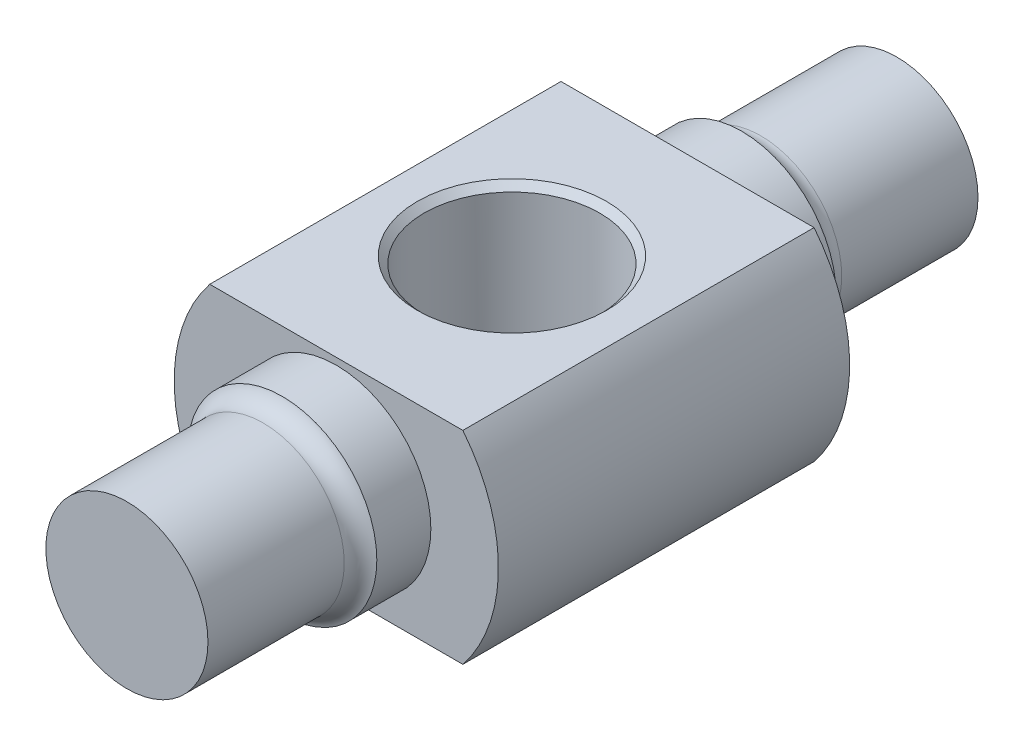
ISO-10303-21;
HEADER;
FILE_DESCRIPTION(('STEP AP214'),'2;1');
FILE_NAME('part.step','',(''),(''),'','','');
FILE_SCHEMA(('AUTOMOTIVE_DESIGN { 1 0 10303 214 1 1 1 1 }'));
ENDSEC;
DATA;
#1=APPLICATION_CONTEXT('core data for automotive mechanical design processes');
#2=APPLICATION_PROTOCOL_DEFINITION('international standard','automotive_design',2000,#1);
#3=PRODUCT_CONTEXT('',#1,'mechanical');
#4=PRODUCT('Part','Part','',(#3));
#5=PRODUCT_RELATED_PRODUCT_CATEGORY('part','',(#4));
#6=PRODUCT_DEFINITION_FORMATION('','',#4);
#7=PRODUCT_DEFINITION_CONTEXT('part definition',#1,'design');
#8=PRODUCT_DEFINITION('design','',#6,#7);
#9=PRODUCT_DEFINITION_SHAPE('','',#8);
#10=(LENGTH_UNIT() NAMED_UNIT(*) SI_UNIT(.MILLI.,.METRE.));
#11=(NAMED_UNIT(*) PLANE_ANGLE_UNIT() SI_UNIT($,.RADIAN.));
#12=(NAMED_UNIT(*) SI_UNIT($,.STERADIAN.) SOLID_ANGLE_UNIT());
#13=UNCERTAINTY_MEASURE_WITH_UNIT(LENGTH_MEASURE(1.E-05),#10,'distance_accuracy_value','');
#14=(GEOMETRIC_REPRESENTATION_CONTEXT(3) GLOBAL_UNCERTAINTY_ASSIGNED_CONTEXT((#13)) GLOBAL_UNIT_ASSIGNED_CONTEXT((#10,
#11,#12)) REPRESENTATION_CONTEXT('',''));
#15=CARTESIAN_POINT('',(0.,0.,0.));
#16=DIRECTION('',(0.,0.,1.));
#17=DIRECTION('',(1.,0.,0.));
#18=AXIS2_PLACEMENT_3D('',#15,#16,#17);
#19=CARTESIAN_POINT('',(0.,0.,11.5));
#20=DIRECTION('',(0.,0.,-1.));
#21=DIRECTION('',(-1.,0.,0.));
#22=AXIS2_PLACEMENT_3D('',#19,#20,#21);
#23=CYLINDRICAL_SURFACE('',#22,6.);
#24=CARTESIAN_POINT('',(0.,0.,10.0857864376269));
#25=DIRECTION('',(0.,0.,1.));
#26=DIRECTION('',(1.,0.,0.));
#27=AXIS2_PLACEMENT_3D('',#24,#25,#26);
#28=CIRCLE('',#27,6.);
#29=CARTESIAN_POINT('',(6.,0.,10.0857864376269));
#30=VERTEX_POINT('',#29);
#31=EDGE_CURVE('E152',#30,#30,#28,.F.);
#32=ORIENTED_EDGE('',*,*,#31,.T.);
#33=EDGE_LOOP('',(#32));
#34=FACE_BOUND('',#33,.T.);
#35=CARTESIAN_POINT('',(0.,0.,0.));
#36=DIRECTION('',(0.,0.,1.));
#37=DIRECTION('',(1.,0.,0.));
#38=AXIS2_PLACEMENT_3D('',#35,#36,#37);
#39=CIRCLE('',#38,6.);
#40=CARTESIAN_POINT('',(6.,0.,0.));
#41=VERTEX_POINT('',#40);
#42=EDGE_CURVE('E140',#41,#41,#39,.T.);
#43=ORIENTED_EDGE('',*,*,#42,.T.);
#44=EDGE_LOOP('',(#43));
#45=FACE_BOUND('',#44,.T.);
#46=ADVANCED_FACE('F44',(#34,#45),#23,.T.);
#47=CARTESIAN_POINT('',(0.,0.,0.));
#48=DIRECTION('',(0.,0.,1.));
#49=DIRECTION('',(1.,0.,0.));
#50=AXIS2_PLACEMENT_3D('',#47,#48,#49);
#51=PLANE('',#50);
#52=ORIENTED_EDGE('',*,*,#42,.F.);
#53=EDGE_LOOP('',(#52));
#54=FACE_BOUND('',#53,.T.);
#55=ADVANCED_FACE('F188',(#54),#51,.F.);
#56=CARTESIAN_POINT('',(0.,0.,15.5));
#57=DIRECTION('',(0.,0.,-1.));
#58=DIRECTION('',(-1.,0.,0.));
#59=AXIS2_PLACEMENT_3D('',#56,#57,#58);
#60=CYLINDRICAL_SURFACE('',#59,7.);
#61=CARTESIAN_POINT('',(0.,0.,15.5));
#62=DIRECTION('',(0.,0.,1.));
#63=DIRECTION('',(1.,0.,0.));
#64=AXIS2_PLACEMENT_3D('',#61,#62,#63);
#65=CIRCLE('',#64,7.);
#66=CARTESIAN_POINT('',(7.,0.,15.5));
#67=VERTEX_POINT('',#66);
#68=EDGE_CURVE('E136',#67,#67,#65,.T.);
#69=ORIENTED_EDGE('',*,*,#68,.F.);
#70=EDGE_LOOP('',(#69));
#71=FACE_BOUND('',#70,.T.);
#72=CARTESIAN_POINT('',(0.,0.,11.5));
#73=DIRECTION('',(0.,0.,1.));
#74=DIRECTION('',(1.,0.,0.));
#75=AXIS2_PLACEMENT_3D('',#72,#73,#74);
#76=CIRCLE('',#75,7.);
#77=CARTESIAN_POINT('',(7.,0.,11.5));
#78=VERTEX_POINT('',#77);
#79=EDGE_CURVE('E135',#78,#78,#76,.T.);
#80=ORIENTED_EDGE('',*,*,#79,.T.);
#81=EDGE_LOOP('',(#80));
#82=FACE_BOUND('',#81,.T.);
#83=ADVANCED_FACE('F184',(#71,#82),#60,.T.);
#84=CARTESIAN_POINT('',(0.,0.,41.5));
#85=DIRECTION('',(0.,0.,-1.));
#86=DIRECTION('',(-1.,0.,0.));
#87=AXIS2_PLACEMENT_3D('',#84,#85,#86);
#88=CYLINDRICAL_SURFACE('',#87,12.);
#89=CARTESIAN_POINT('',(0.,0.,15.5));
#90=DIRECTION('',(0.,0.,1.));
#91=DIRECTION('',(1.,0.,0.));
#92=AXIS2_PLACEMENT_3D('',#89,#90,#91);
#93=CIRCLE('',#92,12.);
#94=CARTESIAN_POINT('',(-9.3674969975976,7.5,15.5));
#95=VERTEX_POINT('',#94);
#96=CARTESIAN_POINT('',(-9.3674969975976,-7.5,15.5));
#97=VERTEX_POINT('',#96);
#98=EDGE_CURVE('E118',#95,#97,#93,.T.);
#99=ORIENTED_EDGE('',*,*,#98,.T.);
#100=DIRECTION('',(0.,0.,-1.));
#101=VECTOR('',#100,1.);
#102=CARTESIAN_POINT('',(-9.3674969975976,-7.5,41.5));
#103=LINE('',#102,#101);
#104=CARTESIAN_POINT('',(-9.3674969975976,-7.5,41.5));
#105=VERTEX_POINT('',#104);
#106=EDGE_CURVE('E107',#105,#97,#103,.T.);
#107=ORIENTED_EDGE('',*,*,#106,.F.);
#108=CARTESIAN_POINT('',(0.,0.,41.5));
#109=DIRECTION('',(0.,0.,1.));
#110=DIRECTION('',(1.,0.,0.));
#111=AXIS2_PLACEMENT_3D('',#108,#109,#110);
#112=CIRCLE('',#111,12.);
#113=CARTESIAN_POINT('',(-9.3674969975976,7.5,41.5));
#114=VERTEX_POINT('',#113);
#115=EDGE_CURVE('E99',#114,#105,#112,.T.);
#116=ORIENTED_EDGE('',*,*,#115,.F.);
#117=DIRECTION('',(0.,0.,-1.));
#118=VECTOR('',#117,1.);
#119=CARTESIAN_POINT('',(-9.3674969975976,7.5,41.5));
#120=LINE('',#119,#118);
#121=EDGE_CURVE('E114',#114,#95,#120,.T.);
#122=ORIENTED_EDGE('',*,*,#121,.T.);
#123=EDGE_LOOP('',(#99,#107,#116,#122));
#124=FACE_BOUND('',#123,.T.);
#125=ADVANCED_FACE('F176',(#124),#88,.T.);
#126=CARTESIAN_POINT('',(-9.3674969975976,-7.5,41.5));
#127=DIRECTION('',(0.,1.,0.));
#128=DIRECTION('',(0.,0.,1.));
#129=AXIS2_PLACEMENT_3D('',#126,#127,#128);
#130=PLANE('',#129);
#131=CARTESIAN_POINT('',(0.,-7.5,28.5));
#132=DIRECTION('',(0.,1.,0.));
#133=DIRECTION('',(0.,0.,1.));
#134=AXIS2_PLACEMENT_3D('',#131,#132,#133);
#135=CIRCLE('',#134,6.99999999999999);
#136=CARTESIAN_POINT('',(0.,-7.5,35.5));
#137=VERTEX_POINT('',#136);
#138=EDGE_CURVE('E156',#137,#137,#135,.T.);
#139=ORIENTED_EDGE('',*,*,#138,.T.);
#140=EDGE_LOOP('',(#139));
#141=FACE_BOUND('',#140,.T.);
#142=DIRECTION('',(1.,0.,0.));
#143=VECTOR('',#142,1.);
#144=CARTESIAN_POINT('',(-9.3674969975976,-7.5,15.5));
#145=LINE('',#144,#143);
#146=CARTESIAN_POINT('',(9.3674969975976,-7.5,15.5));
#147=VERTEX_POINT('',#146);
#148=EDGE_CURVE('E105',#97,#147,#145,.T.);
#149=ORIENTED_EDGE('',*,*,#148,.T.);
#150=DIRECTION('',(0.,0.,-1.));
#151=VECTOR('',#150,1.);
#152=CARTESIAN_POINT('',(9.3674969975976,-7.5,41.5));
#153=LINE('',#152,#151);
#154=CARTESIAN_POINT('',(9.3674969975976,-7.5,41.5));
#155=VERTEX_POINT('',#154);
#156=EDGE_CURVE('E103',#155,#147,#153,.T.);
#157=ORIENTED_EDGE('',*,*,#156,.F.);
#158=DIRECTION('',(1.,0.,0.));
#159=VECTOR('',#158,1.);
#160=CARTESIAN_POINT('',(-9.3674969975976,-7.5,41.5));
#161=LINE('',#160,#159);
#162=EDGE_CURVE('E94',#105,#155,#161,.T.);
#163=ORIENTED_EDGE('',*,*,#162,.F.);
#164=ORIENTED_EDGE('',*,*,#106,.T.);
#165=EDGE_LOOP('',(#149,#157,#163,#164));
#166=FACE_BOUND('',#165,.T.);
#167=ADVANCED_FACE('F104',(#141,#166),#130,.F.);
#168=CARTESIAN_POINT('',(0.,0.,41.5));
#169=DIRECTION('',(0.,0.,-1.));
#170=DIRECTION('',(-1.,0.,0.));
#171=AXIS2_PLACEMENT_3D('',#168,#169,#170);
#172=CYLINDRICAL_SURFACE('',#171,12.);
#173=CARTESIAN_POINT('',(0.,0.,15.5));
#174=DIRECTION('',(0.,0.,1.));
#175=DIRECTION('',(1.,0.,0.));
#176=AXIS2_PLACEMENT_3D('',#173,#174,#175);
#177=CIRCLE('',#176,12.);
#178=CARTESIAN_POINT('',(9.3674969975976,7.5,15.5));
#179=VERTEX_POINT('',#178);
#180=EDGE_CURVE('E80',#147,#179,#177,.T.);
#181=ORIENTED_EDGE('',*,*,#180,.T.);
#182=DIRECTION('',(0.,0.,-1.));
#183=VECTOR('',#182,1.);
#184=CARTESIAN_POINT('',(9.3674969975976,7.5,41.5));
#185=LINE('',#184,#183);
#186=CARTESIAN_POINT('',(9.3674969975976,7.5,41.5));
#187=VERTEX_POINT('',#186);
#188=EDGE_CURVE('E108',#187,#179,#185,.T.);
#189=ORIENTED_EDGE('',*,*,#188,.F.);
#190=CARTESIAN_POINT('',(0.,0.,41.5));
#191=DIRECTION('',(0.,0.,1.));
#192=DIRECTION('',(1.,0.,0.));
#193=AXIS2_PLACEMENT_3D('',#190,#191,#192);
#194=CIRCLE('',#193,12.);
#195=EDGE_CURVE('E97',#155,#187,#194,.T.);
#196=ORIENTED_EDGE('',*,*,#195,.F.);
#197=ORIENTED_EDGE('',*,*,#156,.T.);
#198=EDGE_LOOP('',(#181,#189,#196,#197));
#199=FACE_BOUND('',#198,.T.);
#200=ADVANCED_FACE('F110',(#199),#172,.T.);
#201=CARTESIAN_POINT('',(-9.3674969975976,7.5,41.5));
#202=DIRECTION('',(0.,-1.,0.));
#203=DIRECTION('',(0.,0.,-1.));
#204=AXIS2_PLACEMENT_3D('',#201,#202,#203);
#205=PLANE('',#204);
#206=CARTESIAN_POINT('',(0.,7.5,28.5));
#207=DIRECTION('',(0.,-1.,0.));
#208=DIRECTION('',(0.,0.,-1.));
#209=AXIS2_PLACEMENT_3D('',#206,#207,#208);
#210=CIRCLE('',#209,7.);
#211=CARTESIAN_POINT('',(0.,7.5,21.5));
#212=VERTEX_POINT('',#211);
#213=EDGE_CURVE('E11',#212,#212,#210,.T.);
#214=ORIENTED_EDGE('',*,*,#213,.T.);
#215=EDGE_LOOP('',(#214));
#216=FACE_BOUND('',#215,.T.);
#217=DIRECTION('',(-1.,0.,0.));
#218=VECTOR('',#217,1.);
#219=CARTESIAN_POINT('',(-9.3674969975976,7.5,15.5));
#220=LINE('',#219,#218);
#221=EDGE_CURVE('E86',#179,#95,#220,.T.);
#222=ORIENTED_EDGE('',*,*,#221,.T.);
#223=ORIENTED_EDGE('',*,*,#121,.F.);
#224=DIRECTION('',(-1.,0.,0.));
#225=VECTOR('',#224,1.);
#226=CARTESIAN_POINT('',(-9.3674969975976,7.5,41.5));
#227=LINE('',#226,#225);
#228=EDGE_CURVE('E63',#187,#114,#227,.T.);
#229=ORIENTED_EDGE('',*,*,#228,.F.);
#230=ORIENTED_EDGE('',*,*,#188,.T.);
#231=EDGE_LOOP('',(#222,#223,#229,#230));
#232=FACE_BOUND('',#231,.T.);
#233=ADVANCED_FACE('F182',(#216,#232),#205,.F.);
#234=CARTESIAN_POINT('',(0.,0.,41.5));
#235=DIRECTION('',(0.,0.,1.));
#236=DIRECTION('',(1.,0.,0.));
#237=AXIS2_PLACEMENT_3D('',#234,#235,#236);
#238=PLANE('',#237);
#239=CARTESIAN_POINT('',(0.,0.,41.5));
#240=DIRECTION('',(0.,0.,1.));
#241=DIRECTION('',(1.,0.,0.));
#242=AXIS2_PLACEMENT_3D('',#239,#240,#241);
#243=CIRCLE('',#242,7.);
#244=CARTESIAN_POINT('',(7.,0.,41.5));
#245=VERTEX_POINT('',#244);
#246=EDGE_CURVE('E147',#245,#245,#243,.T.);
#247=ORIENTED_EDGE('',*,*,#246,.F.);
#248=EDGE_LOOP('',(#247));
#249=FACE_BOUND('',#248,.T.);
#250=ORIENTED_EDGE('',*,*,#115,.T.);
#251=ORIENTED_EDGE('',*,*,#162,.T.);
#252=ORIENTED_EDGE('',*,*,#195,.T.);
#253=ORIENTED_EDGE('',*,*,#228,.T.);
#254=EDGE_LOOP('',(#250,#251,#252,#253));
#255=FACE_BOUND('',#254,.T.);
#256=ADVANCED_FACE('F95',(#249,#255),#238,.T.);
#257=CARTESIAN_POINT('',(0.,0.,15.5));
#258=DIRECTION('',(0.,0.,1.));
#259=DIRECTION('',(1.,0.,0.));
#260=AXIS2_PLACEMENT_3D('',#257,#258,#259);
#261=PLANE('',#260);
#262=ORIENTED_EDGE('',*,*,#68,.T.);
#263=EDGE_LOOP('',(#262));
#264=FACE_BOUND('',#263,.T.);
#265=ORIENTED_EDGE('',*,*,#98,.F.);
#266=ORIENTED_EDGE('',*,*,#221,.F.);
#267=ORIENTED_EDGE('',*,*,#180,.F.);
#268=ORIENTED_EDGE('',*,*,#148,.F.);
#269=EDGE_LOOP('',(#265,#266,#267,#268));
#270=FACE_BOUND('',#269,.T.);
#271=ADVANCED_FACE('F226',(#264,#270),#261,.F.);
#272=CARTESIAN_POINT('',(0.,0.,41.5));
#273=DIRECTION('',(0.,0.,1.));
#274=DIRECTION('',(1.,0.,0.));
#275=AXIS2_PLACEMENT_3D('',#272,#273,#274);
#276=CYLINDRICAL_SURFACE('',#275,7.);
#277=ORIENTED_EDGE('',*,*,#246,.T.);
#278=EDGE_LOOP('',(#277));
#279=FACE_BOUND('',#278,.T.);
#280=CARTESIAN_POINT('',(0.,0.,45.5));
#281=DIRECTION('',(0.,0.,1.));
#282=DIRECTION('',(1.,0.,0.));
#283=AXIS2_PLACEMENT_3D('',#280,#281,#282);
#284=CIRCLE('',#283,7.);
#285=CARTESIAN_POINT('',(7.,0.,45.5));
#286=VERTEX_POINT('',#285);
#287=EDGE_CURVE('E122',#286,#286,#284,.T.);
#288=ORIENTED_EDGE('',*,*,#287,.F.);
#289=EDGE_LOOP('',(#288));
#290=FACE_BOUND('',#289,.T.);
#291=ADVANCED_FACE('F229',(#279,#290),#276,.T.);
#292=CARTESIAN_POINT('',(0.,0.,45.5));
#293=DIRECTION('',(0.,0.,1.));
#294=DIRECTION('',(1.,0.,0.));
#295=AXIS2_PLACEMENT_3D('',#292,#293,#294);
#296=CYLINDRICAL_SURFACE('',#295,6.);
#297=CARTESIAN_POINT('',(0.,0.,46.9142135623731));
#298=DIRECTION('',(0.,0.,-1.));
#299=DIRECTION('',(-1.,0.,0.));
#300=AXIS2_PLACEMENT_3D('',#297,#298,#299);
#301=CIRCLE('',#300,6.);
#302=CARTESIAN_POINT('',(-6.,0.,46.9142135623731));
#303=VERTEX_POINT('',#302);
#304=EDGE_CURVE('E148',#303,#303,#301,.F.);
#305=ORIENTED_EDGE('',*,*,#304,.T.);
#306=EDGE_LOOP('',(#305));
#307=FACE_BOUND('',#306,.T.);
#308=CARTESIAN_POINT('',(0.,0.,57.));
#309=DIRECTION('',(0.,0.,1.));
#310=DIRECTION('',(1.,0.,0.));
#311=AXIS2_PLACEMENT_3D('',#308,#309,#310);
#312=CIRCLE('',#311,6.);
#313=CARTESIAN_POINT('',(6.,0.,57.));
#314=VERTEX_POINT('',#313);
#315=EDGE_CURVE('E254',#314,#314,#312,.T.);
#316=ORIENTED_EDGE('',*,*,#315,.F.);
#317=EDGE_LOOP('',(#316));
#318=FACE_BOUND('',#317,.T.);
#319=ADVANCED_FACE('F243',(#307,#318),#296,.T.);
#320=CARTESIAN_POINT('',(0.,0.,57.));
#321=DIRECTION('',(0.,0.,-1.));
#322=DIRECTION('',(1.,0.,0.));
#323=AXIS2_PLACEMENT_3D('',#320,#321,#322);
#324=PLANE('',#323);
#325=ORIENTED_EDGE('',*,*,#315,.T.);
#326=EDGE_LOOP('',(#325));
#327=FACE_BOUND('',#326,.T.);
#328=ADVANCED_FACE('F203',(#327),#324,.F.);
#329=CARTESIAN_POINT('',(0.,0.,46.9142135623731));
#330=DIRECTION('',(0.,0.,-1.));
#331=DIRECTION('',(-1.,0.,0.));
#332=AXIS2_PLACEMENT_3D('',#329,#330,#331);
#333=TOROIDAL_SURFACE('',#332,7.5,1.5);
#334=ORIENTED_EDGE('',*,*,#287,.T.);
#335=EDGE_LOOP('',(#334));
#336=FACE_BOUND('',#335,.T.);
#337=ORIENTED_EDGE('',*,*,#304,.F.);
#338=EDGE_LOOP('',(#337));
#339=FACE_BOUND('',#338,.T.);
#340=ADVANCED_FACE('F199',(#336,#339),#333,.F.);
#341=CARTESIAN_POINT('',(0.,0.,10.0857864376269));
#342=DIRECTION('',(0.,0.,1.));
#343=DIRECTION('',(1.,0.,0.));
#344=AXIS2_PLACEMENT_3D('',#341,#342,#343);
#345=TOROIDAL_SURFACE('',#344,7.5,1.5);
#346=ORIENTED_EDGE('',*,*,#31,.F.);
#347=EDGE_LOOP('',(#346));
#348=FACE_BOUND('',#347,.T.);
#349=ORIENTED_EDGE('',*,*,#79,.F.);
#350=EDGE_LOOP('',(#349));
#351=FACE_BOUND('',#350,.T.);
#352=ADVANCED_FACE('F202',(#348,#351),#345,.F.);
#353=CARTESIAN_POINT('',(0.,-7.5,28.5));
#354=DIRECTION('',(0.,1.,0.));
#355=DIRECTION('',(0.,0.,1.));
#356=AXIS2_PLACEMENT_3D('',#353,#354,#355);
#357=CYLINDRICAL_SURFACE('',#356,6.5);
#358=CARTESIAN_POINT('',(0.,-7.,28.5));
#359=DIRECTION('',(0.,1.,0.));
#360=DIRECTION('',(0.,0.,1.));
#361=AXIS2_PLACEMENT_3D('',#358,#359,#360);
#362=CIRCLE('',#361,6.5);
#363=CARTESIAN_POINT('',(0.,-7.,35.));
#364=VERTEX_POINT('',#363);
#365=EDGE_CURVE('E55',#364,#364,#362,.F.);
#366=ORIENTED_EDGE('',*,*,#365,.T.);
#367=EDGE_LOOP('',(#366));
#368=FACE_BOUND('',#367,.T.);
#369=CARTESIAN_POINT('',(0.,7.00000000000001,28.5));
#370=DIRECTION('',(0.,-1.,0.));
#371=DIRECTION('',(0.,0.,-1.));
#372=AXIS2_PLACEMENT_3D('',#369,#370,#371);
#373=CIRCLE('',#372,6.5);
#374=CARTESIAN_POINT('',(0.,7.00000000000001,22.));
#375=VERTEX_POINT('',#374);
#376=EDGE_CURVE('E160',#375,#375,#373,.F.);
#377=ORIENTED_EDGE('',*,*,#376,.T.);
#378=EDGE_LOOP('',(#377));
#379=FACE_BOUND('',#378,.T.);
#380=ADVANCED_FACE('F167',(#368,#379),#357,.F.);
#381=CARTESIAN_POINT('',(0.,-7.5,28.5));
#382=DIRECTION('',(0.,-1.,0.));
#383=DIRECTION('',(0.,0.,-1.));
#384=AXIS2_PLACEMENT_3D('',#381,#382,#383);
#385=CONICAL_SURFACE('',#384,6.99999999999999,0.785398163397439);
#386=ORIENTED_EDGE('',*,*,#365,.F.);
#387=EDGE_LOOP('',(#386));
#388=FACE_BOUND('',#387,.T.);
#389=ORIENTED_EDGE('',*,*,#138,.F.);
#390=EDGE_LOOP('',(#389));
#391=FACE_BOUND('',#390,.T.);
#392=ADVANCED_FACE('F170',(#388,#391),#385,.F.);
#393=CARTESIAN_POINT('',(0.,7.00000000000001,28.5));
#394=DIRECTION('',(0.,1.,0.));
#395=DIRECTION('',(0.,0.,1.));
#396=AXIS2_PLACEMENT_3D('',#393,#394,#395);
#397=CONICAL_SURFACE('',#396,6.5,0.785398163397454);
#398=ORIENTED_EDGE('',*,*,#213,.F.);
#399=EDGE_LOOP('',(#398));
#400=FACE_BOUND('',#399,.T.);
#401=ORIENTED_EDGE('',*,*,#376,.F.);
#402=EDGE_LOOP('',(#401));
#403=FACE_BOUND('',#402,.T.);
#404=ADVANCED_FACE('F47',(#400,#403),#397,.F.);
#405=CLOSED_SHELL('',(#46,#55,#83,#125,#167,#200,#233,#256,#271,#291,#319,#328,#340,#352,#380,
#392,#404));
#406=MANIFOLD_SOLID_BREP('B2',#405);
#407=ADVANCED_BREP_SHAPE_REPRESENTATION('',(#18,#406),#14);
#408=SHAPE_DEFINITION_REPRESENTATION(#9,#407);
ENDSEC;
END-ISO-10303-21;
